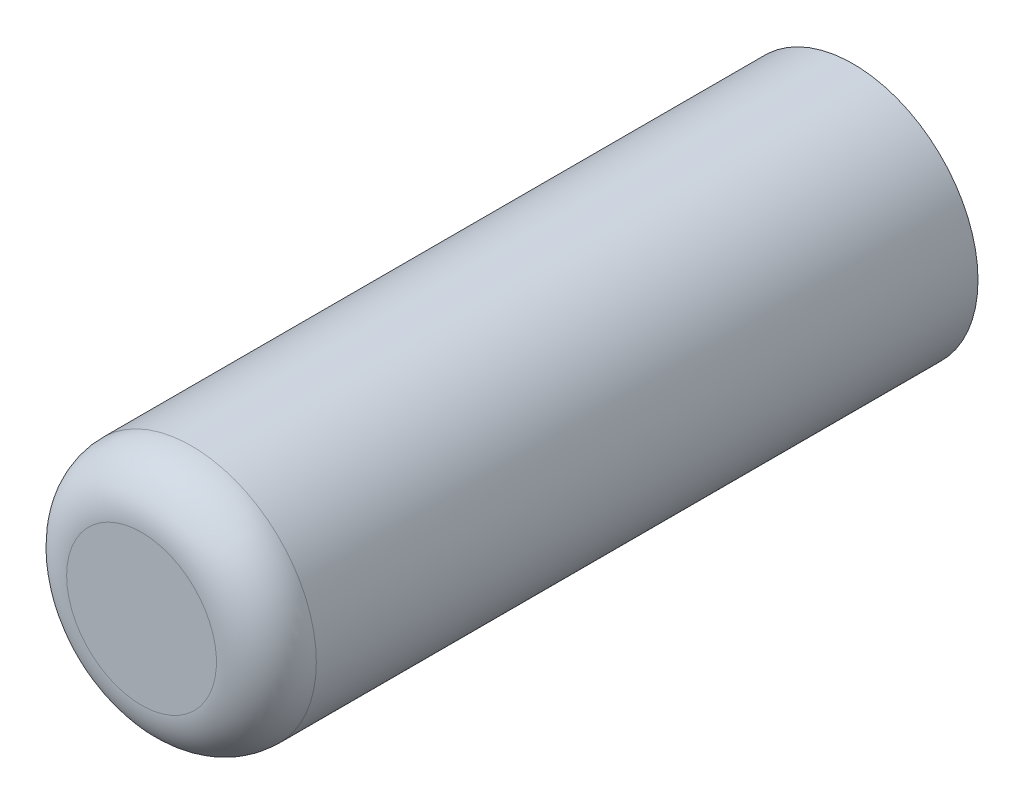
ISO-10303-21;
HEADER;
FILE_DESCRIPTION(('STEP AP214'),'2;1');
FILE_NAME('part.step','',(''),(''),'','','');
FILE_SCHEMA(('AUTOMOTIVE_DESIGN { 1 0 10303 214 1 1 1 1 }'));
ENDSEC;
DATA;
#1=APPLICATION_CONTEXT('core data for automotive mechanical design processes');
#2=APPLICATION_PROTOCOL_DEFINITION('international standard','automotive_design',2000,#1);
#3=PRODUCT_CONTEXT('',#1,'mechanical');
#4=PRODUCT('Part','Part','',(#3));
#5=PRODUCT_RELATED_PRODUCT_CATEGORY('part','',(#4));
#6=PRODUCT_DEFINITION_FORMATION('','',#4);
#7=PRODUCT_DEFINITION_CONTEXT('part definition',#1,'design');
#8=PRODUCT_DEFINITION('design','',#6,#7);
#9=PRODUCT_DEFINITION_SHAPE('','',#8);
#10=(LENGTH_UNIT() NAMED_UNIT(*) SI_UNIT(.MILLI.,.METRE.));
#11=(NAMED_UNIT(*) PLANE_ANGLE_UNIT() SI_UNIT($,.RADIAN.));
#12=(NAMED_UNIT(*) SI_UNIT($,.STERADIAN.) SOLID_ANGLE_UNIT());
#13=UNCERTAINTY_MEASURE_WITH_UNIT(LENGTH_MEASURE(1.E-05),#10,'distance_accuracy_value','');
#14=(GEOMETRIC_REPRESENTATION_CONTEXT(3) GLOBAL_UNCERTAINTY_ASSIGNED_CONTEXT((#13)) GLOBAL_UNIT_ASSIGNED_CONTEXT((#10,
#11,#12)) REPRESENTATION_CONTEXT('',''));
#15=CARTESIAN_POINT('',(0.,0.,0.));
#16=DIRECTION('',(0.,0.,1.));
#17=DIRECTION('',(1.,0.,0.));
#18=AXIS2_PLACEMENT_3D('',#15,#16,#17);
#19=CARTESIAN_POINT('',(0.5,0.,-0.600000000000007));
#20=DIRECTION('',(0.,0.,-1.));
#21=DIRECTION('',(0.,-1.,0.));
#22=AXIS2_PLACEMENT_3D('',#19,#20,#21);
#23=PLANE('',#22);
#24=CARTESIAN_POINT('',(0.,0.,-0.600000000000007));
#25=DIRECTION('',(0.,0.,1.));
#26=DIRECTION('',(1.,0.,0.));
#27=AXIS2_PLACEMENT_3D('',#24,#25,#26);
#28=CIRCLE('',#27,0.5);
#29=CARTESIAN_POINT('',(0.5,0.,-0.600000000000007));
#30=VERTEX_POINT('',#29);
#31=EDGE_CURVE('E10',#30,#30,#28,.T.);
#32=ORIENTED_EDGE('',*,*,#31,.F.);
#33=EDGE_LOOP('',(#32));
#34=FACE_BOUND('',#33,.T.);
#35=ADVANCED_FACE('F15',(#34),#23,.T.);
#36=CARTESIAN_POINT('',(0.,0.,0.825));
#37=DIRECTION('',(0.,0.,1.));
#38=DIRECTION('',(1.,0.,0.));
#39=AXIS2_PLACEMENT_3D('',#36,#37,#38);
#40=CYLINDRICAL_SURFACE('',#39,0.5);
#41=ORIENTED_EDGE('',*,*,#31,.T.);
#42=EDGE_LOOP('',(#41));
#43=FACE_BOUND('',#42,.T.);
#44=CARTESIAN_POINT('',(0.,0.,2.05));
#45=DIRECTION('',(0.,0.,1.));
#46=DIRECTION('',(-1.,0.,0.));
#47=AXIS2_PLACEMENT_3D('',#44,#45,#46);
#48=CIRCLE('',#47,0.5);
#49=CARTESIAN_POINT('',(-0.5,0.,2.05));
#50=VERTEX_POINT('',#49);
#51=EDGE_CURVE('E22',#50,#50,#48,.T.);
#52=ORIENTED_EDGE('',*,*,#51,.F.);
#53=EDGE_LOOP('',(#52));
#54=FACE_BOUND('',#53,.T.);
#55=ADVANCED_FACE('F50',(#43,#54),#40,.T.);
#56=CARTESIAN_POINT('',(0.,0.,2.25));
#57=DIRECTION('',(0.,0.,1.));
#58=DIRECTION('',(1.,0.,0.));
#59=AXIS2_PLACEMENT_3D('',#56,#57,#58);
#60=PLANE('',#59);
#61=CARTESIAN_POINT('',(0.,0.,2.25));
#62=DIRECTION('',(0.,0.,-1.));
#63=DIRECTION('',(-1.,0.,0.));
#64=AXIS2_PLACEMENT_3D('',#61,#62,#63);
#65=CIRCLE('',#64,0.3);
#66=CARTESIAN_POINT('',(-0.3,0.,2.25));
#67=VERTEX_POINT('',#66);
#68=EDGE_CURVE('E33',#67,#67,#65,.T.);
#69=ORIENTED_EDGE('',*,*,#68,.F.);
#70=EDGE_LOOP('',(#69));
#71=FACE_BOUND('',#70,.T.);
#72=ADVANCED_FACE('F44',(#71),#60,.T.);
#73=CARTESIAN_POINT('',(0.,0.,2.05));
#74=DIRECTION('',(0.,0.,1.));
#75=DIRECTION('',(1.,0.,0.));
#76=AXIS2_PLACEMENT_3D('',#73,#74,#75);
#77=TOROIDAL_SURFACE('',#76,0.3,0.2);
#78=ORIENTED_EDGE('',*,*,#51,.T.);
#79=EDGE_LOOP('',(#78));
#80=FACE_BOUND('',#79,.T.);
#81=ORIENTED_EDGE('',*,*,#68,.T.);
#82=EDGE_LOOP('',(#81));
#83=FACE_BOUND('',#82,.T.);
#84=ADVANCED_FACE('F43',(#80,#83),#77,.T.);
#85=CLOSED_SHELL('',(#35,#55,#72,#84));
#86=MANIFOLD_SOLID_BREP('B1',#85);
#87=ADVANCED_BREP_SHAPE_REPRESENTATION('',(#18,#86),#14);
#88=SHAPE_DEFINITION_REPRESENTATION(#9,#87);
ENDSEC;
END-ISO-10303-21;
